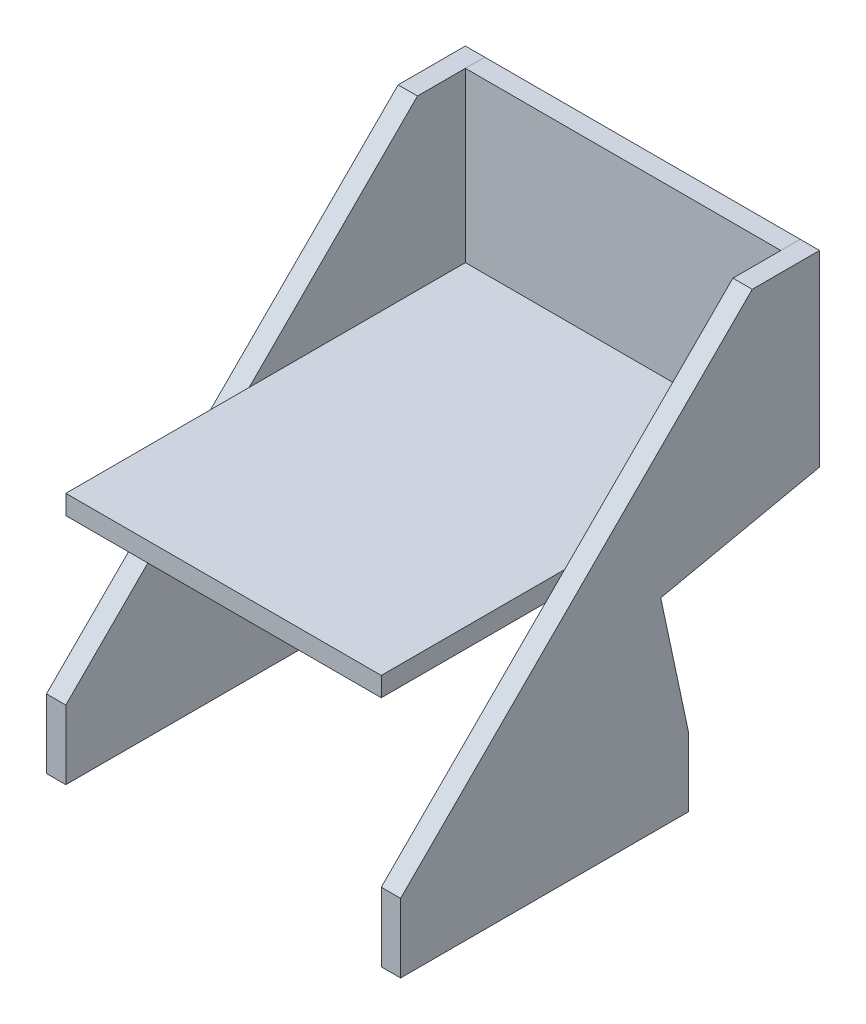
ISO-10303-21;
HEADER;
FILE_DESCRIPTION(('STEP AP214'),'2;1');
FILE_NAME('part.step','',(''),(''),'','','');
FILE_SCHEMA(('AUTOMOTIVE_DESIGN { 1 0 10303 214 1 1 1 1 }'));
ENDSEC;
DATA;
#1=APPLICATION_CONTEXT('core data for automotive mechanical design processes');
#2=APPLICATION_PROTOCOL_DEFINITION('international standard','automotive_design',2000,#1);
#3=PRODUCT_CONTEXT('',#1,'mechanical');
#4=PRODUCT('Part','Part','',(#3));
#5=PRODUCT_RELATED_PRODUCT_CATEGORY('part','',(#4));
#6=PRODUCT_DEFINITION_FORMATION('','',#4);
#7=PRODUCT_DEFINITION_CONTEXT('part definition',#1,'design');
#8=PRODUCT_DEFINITION('design','',#6,#7);
#9=PRODUCT_DEFINITION_SHAPE('','',#8);
#10=(LENGTH_UNIT() NAMED_UNIT(*) SI_UNIT(.MILLI.,.METRE.));
#11=(NAMED_UNIT(*) PLANE_ANGLE_UNIT() SI_UNIT($,.RADIAN.));
#12=(NAMED_UNIT(*) SI_UNIT($,.STERADIAN.) SOLID_ANGLE_UNIT());
#13=UNCERTAINTY_MEASURE_WITH_UNIT(LENGTH_MEASURE(1.E-05),#10,'distance_accuracy_value','');
#14=(GEOMETRIC_REPRESENTATION_CONTEXT(3) GLOBAL_UNCERTAINTY_ASSIGNED_CONTEXT((#13)) GLOBAL_UNIT_ASSIGNED_CONTEXT((#10,
#11,#12)) REPRESENTATION_CONTEXT('',''));
#15=CARTESIAN_POINT('',(0.,0.,0.));
#16=DIRECTION('',(0.,0.,1.));
#17=DIRECTION('',(1.,0.,0.));
#18=AXIS2_PLACEMENT_3D('',#15,#16,#17);
#19=CARTESIAN_POINT('',(21.05,20.,23.75));
#20=DIRECTION('',(0.,0.,-1.));
#21=DIRECTION('',(-1.,0.,0.));
#22=AXIS2_PLACEMENT_3D('',#19,#20,#21);
#23=PLANE('',#22);
#24=DIRECTION('',(0.,-1.,0.));
#25=VECTOR('',#24,1.);
#26=CARTESIAN_POINT('',(21.05,20.,23.75));
#27=LINE('',#26,#25);
#28=CARTESIAN_POINT('',(21.05,-21.7999999999995,23.75));
#29=VERTEX_POINT('',#28);
#30=CARTESIAN_POINT('',(21.05,-30.,23.75));
#31=VERTEX_POINT('',#30);
#32=EDGE_CURVE('E137',#29,#31,#27,.T.);
#33=ORIENTED_EDGE('',*,*,#32,.F.);
#34=DIRECTION('',(-1.,0.,0.));
#35=VECTOR('',#34,1.);
#36=CARTESIAN_POINT('',(21.05,-21.7999999999995,23.75));
#37=LINE('',#36,#35);
#38=CARTESIAN_POINT('',(18.75,-21.7999999999995,23.75));
#39=VERTEX_POINT('',#38);
#40=EDGE_CURVE('E151',#29,#39,#37,.T.);
#41=ORIENTED_EDGE('',*,*,#40,.T.);
#42=DIRECTION('',(0.,-1.,0.));
#43=VECTOR('',#42,1.);
#44=CARTESIAN_POINT('',(18.75,20.,23.75));
#45=LINE('',#44,#43);
#46=CARTESIAN_POINT('',(18.75,-30.,23.75));
#47=VERTEX_POINT('',#46);
#48=EDGE_CURVE('E149',#39,#47,#45,.T.);
#49=ORIENTED_EDGE('',*,*,#48,.T.);
#50=DIRECTION('',(-1.,0.,0.));
#51=VECTOR('',#50,1.);
#52=CARTESIAN_POINT('',(21.05,-30.,23.75));
#53=LINE('',#52,#51);
#54=EDGE_CURVE('E159',#31,#47,#53,.T.);
#55=ORIENTED_EDGE('',*,*,#54,.F.);
#56=EDGE_LOOP('',(#33,#41,#49,#55));
#57=FACE_BOUND('',#56,.T.);
#58=ADVANCED_FACE('F50',(#57),#23,.F.);
#59=CARTESIAN_POINT('',(21.05,-30.,23.75));
#60=DIRECTION('',(0.,1.,0.));
#61=DIRECTION('',(0.,0.,1.));
#62=AXIS2_PLACEMENT_3D('',#59,#60,#61);
#63=PLANE('',#62);
#64=DIRECTION('',(0.,0.,-1.));
#65=VECTOR('',#64,1.);
#66=CARTESIAN_POINT('',(18.75,-30.,23.75));
#67=LINE('',#66,#65);
#68=CARTESIAN_POINT('',(18.75,-30.,-10.4750981265999));
#69=VERTEX_POINT('',#68);
#70=EDGE_CURVE('E130',#47,#69,#67,.T.);
#71=ORIENTED_EDGE('',*,*,#70,.T.);
#72=DIRECTION('',(-1.,0.,0.));
#73=VECTOR('',#72,1.);
#74=CARTESIAN_POINT('',(21.05,-30.,-10.4750981265999));
#75=LINE('',#74,#73);
#76=CARTESIAN_POINT('',(21.05,-30.,-10.4750981265999));
#77=VERTEX_POINT('',#76);
#78=EDGE_CURVE('E64',#77,#69,#75,.T.);
#79=ORIENTED_EDGE('',*,*,#78,.F.);
#80=DIRECTION('',(0.,0.,-1.));
#81=VECTOR('',#80,1.);
#82=CARTESIAN_POINT('',(21.05,-30.,23.75));
#83=LINE('',#82,#81);
#84=EDGE_CURVE('E127',#31,#77,#83,.T.);
#85=ORIENTED_EDGE('',*,*,#84,.F.);
#86=ORIENTED_EDGE('',*,*,#54,.T.);
#87=EDGE_LOOP('',(#71,#79,#85,#86));
#88=FACE_BOUND('',#87,.T.);
#89=ADVANCED_FACE('F125',(#88),#63,.F.);
#90=CARTESIAN_POINT('',(21.05,20.,-26.05));
#91=DIRECTION('',(0.,0.,1.));
#92=DIRECTION('',(1.,0.,0.));
#93=AXIS2_PLACEMENT_3D('',#90,#91,#92);
#94=PLANE('',#93);
#95=DIRECTION('',(0.,1.,0.));
#96=VECTOR('',#95,1.);
#97=CARTESIAN_POINT('',(21.05,20.,-26.05));
#98=LINE('',#97,#96);
#99=CARTESIAN_POINT('',(21.05,-2.3,-26.05));
#100=VERTEX_POINT('',#99);
#101=CARTESIAN_POINT('',(21.05,20.,-26.05));
#102=VERTEX_POINT('',#101);
#103=EDGE_CURVE('E138',#100,#102,#98,.T.);
#104=ORIENTED_EDGE('',*,*,#103,.F.);
#105=DIRECTION('',(-1.,0.,0.));
#106=VECTOR('',#105,1.);
#107=CARTESIAN_POINT('',(21.05,-2.3,-26.05));
#108=LINE('',#107,#106);
#109=CARTESIAN_POINT('',(18.75,-2.3,-26.05));
#110=VERTEX_POINT('',#109);
#111=EDGE_CURVE('E176',#100,#110,#108,.T.);
#112=ORIENTED_EDGE('',*,*,#111,.T.);
#113=DIRECTION('',(0.,1.,0.));
#114=VECTOR('',#113,1.);
#115=CARTESIAN_POINT('',(18.75,20.,-26.05));
#116=LINE('',#115,#114);
#117=CARTESIAN_POINT('',(18.75,20.,-26.05));
#118=VERTEX_POINT('',#117);
#119=EDGE_CURVE('E153',#110,#118,#116,.T.);
#120=ORIENTED_EDGE('',*,*,#119,.T.);
#121=DIRECTION('',(-1.,0.,0.));
#122=VECTOR('',#121,1.);
#123=CARTESIAN_POINT('',(21.05,20.,-26.05));
#124=LINE('',#123,#122);
#125=EDGE_CURVE('E148',#102,#118,#124,.T.);
#126=ORIENTED_EDGE('',*,*,#125,.F.);
#127=EDGE_LOOP('',(#104,#112,#120,#126));
#128=FACE_BOUND('',#127,.T.);
#129=ADVANCED_FACE('F194',(#128),#94,.F.);
#130=CARTESIAN_POINT('',(21.05,20.,23.75));
#131=DIRECTION('',(0.,-1.,0.));
#132=DIRECTION('',(0.,0.,-1.));
#133=AXIS2_PLACEMENT_3D('',#130,#131,#132);
#134=PLANE('',#133);
#135=DIRECTION('',(0.,0.,1.));
#136=VECTOR('',#135,1.);
#137=CARTESIAN_POINT('',(18.75,20.,23.75));
#138=LINE('',#137,#136);
#139=CARTESIAN_POINT('',(18.75,20.,-18.05));
#140=VERTEX_POINT('',#139);
#141=EDGE_CURVE('E142',#118,#140,#138,.T.);
#142=ORIENTED_EDGE('',*,*,#141,.T.);
#143=DIRECTION('',(-1.,0.,0.));
#144=VECTOR('',#143,1.);
#145=CARTESIAN_POINT('',(21.05,20.,-18.05));
#146=LINE('',#145,#144);
#147=CARTESIAN_POINT('',(21.05,20.,-18.05));
#148=VERTEX_POINT('',#147);
#149=EDGE_CURVE('E72',#148,#140,#146,.T.);
#150=ORIENTED_EDGE('',*,*,#149,.F.);
#151=DIRECTION('',(0.,0.,1.));
#152=VECTOR('',#151,1.);
#153=CARTESIAN_POINT('',(21.05,20.,23.75));
#154=LINE('',#153,#152);
#155=EDGE_CURVE('E140',#102,#148,#154,.T.);
#156=ORIENTED_EDGE('',*,*,#155,.F.);
#157=ORIENTED_EDGE('',*,*,#125,.T.);
#158=EDGE_LOOP('',(#142,#150,#156,#157));
#159=FACE_BOUND('',#158,.T.);
#160=ADVANCED_FACE('F189',(#159),#134,.F.);
#161=CARTESIAN_POINT('',(21.05,0.,0.));
#162=DIRECTION('',(1.,0.,0.));
#163=DIRECTION('',(0.,0.,-1.));
#164=AXIS2_PLACEMENT_3D('',#161,#162,#163);
#165=PLANE('',#164);
#166=DIRECTION('',(0.,0.208647904824842,-0.977990823991822));
#167=VECTOR('',#166,1.);
#168=CARTESIAN_POINT('',(21.05,-2.3,-26.05));
#169=LINE('',#168,#167);
#170=CARTESIAN_POINT('',(21.05,-6.32706006023282,-7.17404823869224));
#171=VERTEX_POINT('',#170);
#172=EDGE_CURVE('E131',#171,#100,#169,.T.);
#173=ORIENTED_EDGE('',*,*,#172,.T.);
#174=ORIENTED_EDGE('',*,*,#103,.T.);
#175=ORIENTED_EDGE('',*,*,#155,.T.);
#176=DIRECTION('',(0.,-0.707106781186544,0.707106781186552));
#177=VECTOR('',#176,1.);
#178=CARTESIAN_POINT('',(21.05,20.,-18.05));
#179=LINE('',#178,#177);
#180=EDGE_CURVE('E178',#148,#29,#179,.T.);
#181=ORIENTED_EDGE('',*,*,#180,.T.);
#182=ORIENTED_EDGE('',*,*,#32,.T.);
#183=ORIENTED_EDGE('',*,*,#84,.T.);
#184=DIRECTION('',(0.,1.,0.));
#185=VECTOR('',#184,1.);
#186=CARTESIAN_POINT('',(21.05,-21.7999999999995,-10.4750981265999));
#187=LINE('',#186,#185);
#188=CARTESIAN_POINT('',(21.05,-21.7999999999995,-10.4750981265999));
#189=VERTEX_POINT('',#188);
#190=EDGE_CURVE('E112',#77,#189,#187,.T.);
#191=ORIENTED_EDGE('',*,*,#190,.T.);
#192=DIRECTION('',(0.,0.977990823991822,0.208647904824842));
#193=VECTOR('',#192,1.);
#194=CARTESIAN_POINT('',(21.05,-6.32706006023282,-7.17404823869224));
#195=LINE('',#194,#193);
#196=EDGE_CURVE('E120',#189,#171,#195,.T.);
#197=ORIENTED_EDGE('',*,*,#196,.T.);
#198=EDGE_LOOP('',(#173,#174,#175,#181,#182,#183,#191,#197));
#199=FACE_BOUND('',#198,.T.);
#200=ADVANCED_FACE('F134',(#199),#165,.T.);
#201=CARTESIAN_POINT('',(18.75,0.,0.));
#202=DIRECTION('',(1.,0.,0.));
#203=DIRECTION('',(0.,0.,-1.));
#204=AXIS2_PLACEMENT_3D('',#201,#202,#203);
#205=PLANE('',#204);
#206=ORIENTED_EDGE('',*,*,#119,.F.);
#207=DIRECTION('',(0.,-0.208647904824842,0.977990823991822));
#208=VECTOR('',#207,1.);
#209=CARTESIAN_POINT('',(18.75,-7.51552385144544,-1.60338754392887));
#210=LINE('',#209,#208);
#211=CARTESIAN_POINT('',(18.75,-6.32706006023282,-7.17404823869224));
#212=VERTEX_POINT('',#211);
#213=EDGE_CURVE('E12',#110,#212,#210,.T.);
#214=ORIENTED_EDGE('',*,*,#213,.T.);
#215=DIRECTION('',(0.,-0.977990823991822,-0.208647904824842));
#216=VECTOR('',#215,1.);
#217=CARTESIAN_POINT('',(18.75,1.18846379121262,-5.57066069476337));
#218=LINE('',#217,#216);
#219=CARTESIAN_POINT('',(18.75,-21.7999999999995,-10.4750981265999));
#220=VERTEX_POINT('',#219);
#221=EDGE_CURVE('E57',#212,#220,#218,.T.);
#222=ORIENTED_EDGE('',*,*,#221,.T.);
#223=DIRECTION('',(0.,-1.,0.));
#224=VECTOR('',#223,1.);
#225=CARTESIAN_POINT('',(18.75,0.,-10.4750981265999));
#226=LINE('',#225,#224);
#227=EDGE_CURVE('E163',#220,#69,#226,.T.);
#228=ORIENTED_EDGE('',*,*,#227,.T.);
#229=ORIENTED_EDGE('',*,*,#70,.F.);
#230=ORIENTED_EDGE('',*,*,#48,.F.);
#231=DIRECTION('',(0.,0.707106781186544,-0.707106781186552));
#232=VECTOR('',#231,1.);
#233=CARTESIAN_POINT('',(18.75,0.975000000000116,0.975000000000104));
#234=LINE('',#233,#232);
#235=EDGE_CURVE('E161',#39,#140,#234,.T.);
#236=ORIENTED_EDGE('',*,*,#235,.T.);
#237=ORIENTED_EDGE('',*,*,#141,.F.);
#238=EDGE_LOOP('',(#206,#214,#222,#228,#229,#230,#236,#237));
#239=FACE_BOUND('',#238,.T.);
#240=ADVANCED_FACE('F167',(#239),#205,.F.);
#241=CARTESIAN_POINT('',(21.05,20.,-18.05));
#242=DIRECTION('',(0.,-0.707106781186552,-0.707106781186544));
#243=DIRECTION('',(0.,0.707106781186544,-0.707106781186552));
#244=AXIS2_PLACEMENT_3D('',#241,#242,#243);
#245=PLANE('',#244);
#246=ORIENTED_EDGE('',*,*,#40,.F.);
#247=ORIENTED_EDGE('',*,*,#180,.F.);
#248=ORIENTED_EDGE('',*,*,#149,.T.);
#249=ORIENTED_EDGE('',*,*,#235,.F.);
#250=EDGE_LOOP('',(#246,#247,#248,#249));
#251=FACE_BOUND('',#250,.T.);
#252=ADVANCED_FACE('F196',(#251),#245,.F.);
#253=CARTESIAN_POINT('',(21.05,-2.3,-26.05));
#254=DIRECTION('',(0.,0.977990823991822,0.208647904824842));
#255=DIRECTION('',(0.,-0.208647904824842,0.977990823991822));
#256=AXIS2_PLACEMENT_3D('',#253,#254,#255);
#257=PLANE('',#256);
#258=ORIENTED_EDGE('',*,*,#111,.F.);
#259=ORIENTED_EDGE('',*,*,#172,.F.);
#260=DIRECTION('',(-1.,0.,0.));
#261=VECTOR('',#260,1.);
#262=CARTESIAN_POINT('',(21.05,-6.32706006023282,-7.17404823869224));
#263=LINE('',#262,#261);
#264=EDGE_CURVE('E171',#171,#212,#263,.T.);
#265=ORIENTED_EDGE('',*,*,#264,.T.);
#266=ORIENTED_EDGE('',*,*,#213,.F.);
#267=EDGE_LOOP('',(#258,#259,#265,#266));
#268=FACE_BOUND('',#267,.T.);
#269=ADVANCED_FACE('F174',(#268),#257,.F.);
#270=CARTESIAN_POINT('',(21.05,-6.32706006023282,-7.17404823869224));
#271=DIRECTION('',(0.,-0.208647904824842,0.977990823991822));
#272=DIRECTION('',(0.,-0.977990823991822,-0.208647904824842));
#273=AXIS2_PLACEMENT_3D('',#270,#271,#272);
#274=PLANE('',#273);
#275=ORIENTED_EDGE('',*,*,#264,.F.);
#276=ORIENTED_EDGE('',*,*,#196,.F.);
#277=DIRECTION('',(-1.,0.,0.));
#278=VECTOR('',#277,1.);
#279=CARTESIAN_POINT('',(21.05,-21.7999999999995,-10.4750981265999));
#280=LINE('',#279,#278);
#281=EDGE_CURVE('E115',#189,#220,#280,.T.);
#282=ORIENTED_EDGE('',*,*,#281,.T.);
#283=ORIENTED_EDGE('',*,*,#221,.F.);
#284=EDGE_LOOP('',(#275,#276,#282,#283));
#285=FACE_BOUND('',#284,.T.);
#286=ADVANCED_FACE('F170',(#285),#274,.F.);
#287=CARTESIAN_POINT('',(21.05,-21.7999999999995,-10.4750981265999));
#288=DIRECTION('',(0.,0.,1.));
#289=DIRECTION('',(1.,0.,0.));
#290=AXIS2_PLACEMENT_3D('',#287,#288,#289);
#291=PLANE('',#290);
#292=ORIENTED_EDGE('',*,*,#281,.F.);
#293=ORIENTED_EDGE('',*,*,#190,.F.);
#294=ORIENTED_EDGE('',*,*,#78,.T.);
#295=ORIENTED_EDGE('',*,*,#227,.F.);
#296=EDGE_LOOP('',(#292,#293,#294,#295));
#297=FACE_BOUND('',#296,.T.);
#298=ADVANCED_FACE('F113',(#297),#291,.F.);
#299=CLOSED_SHELL('',(#58,#89,#129,#160,#200,#240,#252,#269,#286,#298));
#300=MANIFOLD_SOLID_BREP('B2',#299);
#301=CARTESIAN_POINT('',(-18.75,20.,-26.05));
#302=DIRECTION('',(1.,0.,0.));
#303=DIRECTION('',(0.,0.,-1.));
#304=AXIS2_PLACEMENT_3D('',#301,#302,#303);
#305=PLANE('',#304);
#306=DIRECTION('',(0.,1.,0.));
#307=VECTOR('',#306,1.);
#308=CARTESIAN_POINT('',(-18.75,20.,-23.75));
#309=LINE('',#308,#307);
#310=CARTESIAN_POINT('',(-18.75,-2.3,-23.75));
#311=VERTEX_POINT('',#310);
#312=CARTESIAN_POINT('',(-18.75,20.,-23.75));
#313=VERTEX_POINT('',#312);
#314=EDGE_CURVE('E363',#311,#313,#309,.T.);
#315=ORIENTED_EDGE('',*,*,#314,.T.);
#316=DIRECTION('',(0.,0.,1.));
#317=VECTOR('',#316,1.);
#318=CARTESIAN_POINT('',(-18.75,20.,-26.05));
#319=LINE('',#318,#317);
#320=CARTESIAN_POINT('',(-18.75,20.,-26.05));
#321=VERTEX_POINT('',#320);
#322=EDGE_CURVE('E48',#321,#313,#319,.T.);
#323=ORIENTED_EDGE('',*,*,#322,.F.);
#324=DIRECTION('',(0.,1.,0.));
#325=VECTOR('',#324,1.);
#326=CARTESIAN_POINT('',(-18.75,20.,-26.05));
#327=LINE('',#326,#325);
#328=CARTESIAN_POINT('',(-18.75,-2.3,-26.05));
#329=VERTEX_POINT('',#328);
#330=EDGE_CURVE('E351',#329,#321,#327,.T.);
#331=ORIENTED_EDGE('',*,*,#330,.F.);
#332=DIRECTION('',(0.,0.,1.));
#333=VECTOR('',#332,1.);
#334=CARTESIAN_POINT('',(-18.75,-2.3,-26.05));
#335=LINE('',#334,#333);
#336=EDGE_CURVE('E359',#329,#311,#335,.T.);
#337=ORIENTED_EDGE('',*,*,#336,.T.);
#338=EDGE_LOOP('',(#315,#323,#331,#337));
#339=FACE_BOUND('',#338,.T.);
#340=ADVANCED_FACE('F300',(#339),#305,.F.);
#341=CARTESIAN_POINT('',(-18.75,20.,-26.05));
#342=DIRECTION('',(0.,-1.,0.));
#343=DIRECTION('',(0.,0.,-1.));
#344=AXIS2_PLACEMENT_3D('',#341,#342,#343);
#345=PLANE('',#344);
#346=DIRECTION('',(1.,0.,0.));
#347=VECTOR('',#346,1.);
#348=CARTESIAN_POINT('',(-18.75,20.,-23.75));
#349=LINE('',#348,#347);
#350=CARTESIAN_POINT('',(18.75,20.,-23.75));
#351=VERTEX_POINT('',#350);
#352=EDGE_CURVE('E355',#313,#351,#349,.T.);
#353=ORIENTED_EDGE('',*,*,#352,.T.);
#354=DIRECTION('',(0.,0.,1.));
#355=VECTOR('',#354,1.);
#356=CARTESIAN_POINT('',(18.75,20.,-26.05));
#357=LINE('',#356,#355);
#358=CARTESIAN_POINT('',(18.75,20.,-26.05));
#359=VERTEX_POINT('',#358);
#360=EDGE_CURVE('E308',#359,#351,#357,.T.);
#361=ORIENTED_EDGE('',*,*,#360,.F.);
#362=DIRECTION('',(1.,0.,0.));
#363=VECTOR('',#362,1.);
#364=CARTESIAN_POINT('',(-18.75,20.,-26.05));
#365=LINE('',#364,#363);
#366=EDGE_CURVE('E346',#321,#359,#365,.T.);
#367=ORIENTED_EDGE('',*,*,#366,.F.);
#368=ORIENTED_EDGE('',*,*,#322,.T.);
#369=EDGE_LOOP('',(#353,#361,#367,#368));
#370=FACE_BOUND('',#369,.T.);
#371=ADVANCED_FACE('F354',(#370),#345,.F.);
#372=CARTESIAN_POINT('',(18.75,20.,-26.05));
#373=DIRECTION('',(-1.,0.,0.));
#374=DIRECTION('',(0.,0.,1.));
#375=AXIS2_PLACEMENT_3D('',#372,#373,#374);
#376=PLANE('',#375);
#377=DIRECTION('',(0.,-1.,0.));
#378=VECTOR('',#377,1.);
#379=CARTESIAN_POINT('',(18.75,20.,-23.75));
#380=LINE('',#379,#378);
#381=CARTESIAN_POINT('',(18.75,-2.3,-23.75));
#382=VERTEX_POINT('',#381);
#383=EDGE_CURVE('E333',#351,#382,#380,.T.);
#384=ORIENTED_EDGE('',*,*,#383,.T.);
#385=DIRECTION('',(0.,0.,1.));
#386=VECTOR('',#385,1.);
#387=CARTESIAN_POINT('',(18.75,-2.3,-26.05));
#388=LINE('',#387,#386);
#389=CARTESIAN_POINT('',(18.75,-2.3,-26.05));
#390=VERTEX_POINT('',#389);
#391=EDGE_CURVE('E356',#390,#382,#388,.T.);
#392=ORIENTED_EDGE('',*,*,#391,.F.);
#393=DIRECTION('',(0.,-1.,0.));
#394=VECTOR('',#393,1.);
#395=CARTESIAN_POINT('',(18.75,20.,-26.05));
#396=LINE('',#395,#394);
#397=EDGE_CURVE('E349',#359,#390,#396,.T.);
#398=ORIENTED_EDGE('',*,*,#397,.F.);
#399=ORIENTED_EDGE('',*,*,#360,.T.);
#400=EDGE_LOOP('',(#384,#392,#398,#399));
#401=FACE_BOUND('',#400,.T.);
#402=ADVANCED_FACE('F357',(#401),#376,.F.);
#403=CARTESIAN_POINT('',(-18.75,-2.3,-26.05));
#404=DIRECTION('',(0.,1.,0.));
#405=DIRECTION('',(0.,0.,1.));
#406=AXIS2_PLACEMENT_3D('',#403,#404,#405);
#407=PLANE('',#406);
#408=DIRECTION('',(-1.,0.,0.));
#409=VECTOR('',#408,1.);
#410=CARTESIAN_POINT('',(-18.75,-2.3,-23.75));
#411=LINE('',#410,#409);
#412=EDGE_CURVE('E339',#382,#311,#411,.T.);
#413=ORIENTED_EDGE('',*,*,#412,.T.);
#414=ORIENTED_EDGE('',*,*,#336,.F.);
#415=DIRECTION('',(-1.,0.,0.));
#416=VECTOR('',#415,1.);
#417=CARTESIAN_POINT('',(-18.75,-2.3,-26.05));
#418=LINE('',#417,#416);
#419=EDGE_CURVE('E316',#390,#329,#418,.T.);
#420=ORIENTED_EDGE('',*,*,#419,.F.);
#421=ORIENTED_EDGE('',*,*,#391,.T.);
#422=EDGE_LOOP('',(#413,#414,#420,#421));
#423=FACE_BOUND('',#422,.T.);
#424=ADVANCED_FACE('F370',(#423),#407,.F.);
#425=CARTESIAN_POINT('',(0.,0.,-26.05));
#426=DIRECTION('',(0.,0.,1.));
#427=DIRECTION('',(1.,0.,0.));
#428=AXIS2_PLACEMENT_3D('',#425,#426,#427);
#429=PLANE('',#428);
#430=ORIENTED_EDGE('',*,*,#330,.T.);
#431=ORIENTED_EDGE('',*,*,#366,.T.);
#432=ORIENTED_EDGE('',*,*,#397,.T.);
#433=ORIENTED_EDGE('',*,*,#419,.T.);
#434=EDGE_LOOP('',(#430,#431,#432,#433));
#435=FACE_BOUND('',#434,.T.);
#436=ADVANCED_FACE('F347',(#435),#429,.F.);
#437=CARTESIAN_POINT('',(0.,0.,-23.75));
#438=DIRECTION('',(0.,0.,1.));
#439=DIRECTION('',(1.,0.,0.));
#440=AXIS2_PLACEMENT_3D('',#437,#438,#439);
#441=PLANE('',#440);
#442=ORIENTED_EDGE('',*,*,#314,.F.);
#443=ORIENTED_EDGE('',*,*,#412,.F.);
#444=ORIENTED_EDGE('',*,*,#383,.F.);
#445=ORIENTED_EDGE('',*,*,#352,.F.);
#446=EDGE_LOOP('',(#442,#443,#444,#445));
#447=FACE_BOUND('',#446,.T.);
#448=ADVANCED_FACE('F373',(#447),#441,.T.);
#449=CLOSED_SHELL('',(#340,#371,#402,#424,#436,#448));
#450=MANIFOLD_SOLID_BREP('B6',#449);
#451=CARTESIAN_POINT('',(-21.05,20.,-26.05));
#452=DIRECTION('',(0.,0.,1.));
#453=DIRECTION('',(0.,-1.,0.));
#454=AXIS2_PLACEMENT_3D('',#451,#452,#453);
#455=PLANE('',#454);
#456=DIRECTION('',(0.,-1.,0.));
#457=VECTOR('',#456,1.);
#458=CARTESIAN_POINT('',(-18.75,20.,-26.05));
#459=LINE('',#458,#457);
#460=CARTESIAN_POINT('',(-18.75,20.,-26.05));
#461=VERTEX_POINT('',#460);
#462=CARTESIAN_POINT('',(-18.75,-2.3,-26.05));
#463=VERTEX_POINT('',#462);
#464=EDGE_CURVE('E532',#461,#463,#459,.T.);
#465=ORIENTED_EDGE('',*,*,#464,.T.);
#466=DIRECTION('',(-1.,0.,0.));
#467=VECTOR('',#466,1.);
#468=CARTESIAN_POINT('',(21.05,-2.3,-26.05));
#469=LINE('',#468,#467);
#470=CARTESIAN_POINT('',(-21.05,-2.3,-26.05));
#471=VERTEX_POINT('',#470);
#472=EDGE_CURVE('E556',#463,#471,#469,.T.);
#473=ORIENTED_EDGE('',*,*,#472,.T.);
#474=DIRECTION('',(0.,-1.,0.));
#475=VECTOR('',#474,1.);
#476=CARTESIAN_POINT('',(-21.05,20.,-26.05));
#477=LINE('',#476,#475);
#478=CARTESIAN_POINT('',(-21.05,20.,-26.05));
#479=VERTEX_POINT('',#478);
#480=EDGE_CURVE('E521',#479,#471,#477,.T.);
#481=ORIENTED_EDGE('',*,*,#480,.F.);
#482=DIRECTION('',(1.,0.,0.));
#483=VECTOR('',#482,1.);
#484=CARTESIAN_POINT('',(-21.05,20.,-26.05));
#485=LINE('',#484,#483);
#486=EDGE_CURVE('E531',#479,#461,#485,.T.);
#487=ORIENTED_EDGE('',*,*,#486,.T.);
#488=EDGE_LOOP('',(#465,#473,#481,#487));
#489=FACE_BOUND('',#488,.T.);
#490=ADVANCED_FACE('F433',(#489),#455,.F.);
#491=CARTESIAN_POINT('',(-21.05,-30.,-26.05));
#492=DIRECTION('',(0.,1.,0.));
#493=DIRECTION('',(0.,0.,1.));
#494=AXIS2_PLACEMENT_3D('',#491,#492,#493);
#495=PLANE('',#494);
#496=DIRECTION('',(0.,0.,1.));
#497=VECTOR('',#496,1.);
#498=CARTESIAN_POINT('',(-21.05,-30.,-26.05));
#499=LINE('',#498,#497);
#500=CARTESIAN_POINT('',(-21.05,-30.,-10.4750981265999));
#501=VERTEX_POINT('',#500);
#502=CARTESIAN_POINT('',(-21.05,-30.,23.75));
#503=VERTEX_POINT('',#502);
#504=EDGE_CURVE('E511',#501,#503,#499,.T.);
#505=ORIENTED_EDGE('',*,*,#504,.F.);
#506=DIRECTION('',(-1.,0.,0.));
#507=VECTOR('',#506,1.);
#508=CARTESIAN_POINT('',(21.05,-30.,-10.4750981265999));
#509=LINE('',#508,#507);
#510=CARTESIAN_POINT('',(-18.75,-30.,-10.4750981265999));
#511=VERTEX_POINT('',#510);
#512=EDGE_CURVE('E495',#511,#501,#509,.T.);
#513=ORIENTED_EDGE('',*,*,#512,.F.);
#514=DIRECTION('',(0.,0.,1.));
#515=VECTOR('',#514,1.);
#516=CARTESIAN_POINT('',(-18.75,-30.,-26.05));
#517=LINE('',#516,#515);
#518=CARTESIAN_POINT('',(-18.75,-30.,23.75));
#519=VERTEX_POINT('',#518);
#520=EDGE_CURVE('E535',#511,#519,#517,.T.);
#521=ORIENTED_EDGE('',*,*,#520,.T.);
#522=DIRECTION('',(1.,0.,0.));
#523=VECTOR('',#522,1.);
#524=CARTESIAN_POINT('',(-21.05,-30.,23.75));
#525=LINE('',#524,#523);
#526=EDGE_CURVE('E518',#503,#519,#525,.T.);
#527=ORIENTED_EDGE('',*,*,#526,.F.);
#528=EDGE_LOOP('',(#505,#513,#521,#527));
#529=FACE_BOUND('',#528,.T.);
#530=ADVANCED_FACE('F516',(#529),#495,.F.);
#531=CARTESIAN_POINT('',(-21.05,20.,23.75));
#532=DIRECTION('',(0.,0.,-1.));
#533=DIRECTION('',(0.,1.,0.));
#534=AXIS2_PLACEMENT_3D('',#531,#532,#533);
#535=PLANE('',#534);
#536=DIRECTION('',(0.,1.,0.));
#537=VECTOR('',#536,1.);
#538=CARTESIAN_POINT('',(-18.75,20.,23.75));
#539=LINE('',#538,#537);
#540=CARTESIAN_POINT('',(-18.75,-21.7999999999995,23.75));
#541=VERTEX_POINT('',#540);
#542=EDGE_CURVE('E538',#519,#541,#539,.T.);
#543=ORIENTED_EDGE('',*,*,#542,.T.);
#544=DIRECTION('',(-1.,0.,0.));
#545=VECTOR('',#544,1.);
#546=CARTESIAN_POINT('',(21.05,-21.7999999999995,23.75));
#547=LINE('',#546,#545);
#548=CARTESIAN_POINT('',(-21.05,-21.7999999999995,23.75));
#549=VERTEX_POINT('',#548);
#550=EDGE_CURVE('E455',#541,#549,#547,.T.);
#551=ORIENTED_EDGE('',*,*,#550,.T.);
#552=DIRECTION('',(0.,1.,0.));
#553=VECTOR('',#552,1.);
#554=CARTESIAN_POINT('',(-21.05,20.,23.75));
#555=LINE('',#554,#553);
#556=EDGE_CURVE('E520',#503,#549,#555,.T.);
#557=ORIENTED_EDGE('',*,*,#556,.F.);
#558=ORIENTED_EDGE('',*,*,#526,.T.);
#559=EDGE_LOOP('',(#543,#551,#557,#558));
#560=FACE_BOUND('',#559,.T.);
#561=ADVANCED_FACE('F570',(#560),#535,.F.);
#562=CARTESIAN_POINT('',(-21.05,20.,-26.05));
#563=DIRECTION('',(0.,-1.,0.));
#564=DIRECTION('',(0.,0.,-1.));
#565=AXIS2_PLACEMENT_3D('',#562,#563,#564);
#566=PLANE('',#565);
#567=DIRECTION('',(0.,0.,-1.));
#568=VECTOR('',#567,1.);
#569=CARTESIAN_POINT('',(-21.05,20.,-26.05));
#570=LINE('',#569,#568);
#571=CARTESIAN_POINT('',(-21.05,20.,-18.05));
#572=VERTEX_POINT('',#571);
#573=EDGE_CURVE('E523',#572,#479,#570,.T.);
#574=ORIENTED_EDGE('',*,*,#573,.F.);
#575=DIRECTION('',(-1.,0.,0.));
#576=VECTOR('',#575,1.);
#577=CARTESIAN_POINT('',(21.05,20.,-18.05));
#578=LINE('',#577,#576);
#579=CARTESIAN_POINT('',(-18.75,20.,-18.05));
#580=VERTEX_POINT('',#579);
#581=EDGE_CURVE('E559',#580,#572,#578,.T.);
#582=ORIENTED_EDGE('',*,*,#581,.F.);
#583=DIRECTION('',(0.,0.,-1.));
#584=VECTOR('',#583,1.);
#585=CARTESIAN_POINT('',(-18.75,20.,-26.05));
#586=LINE('',#585,#584);
#587=EDGE_CURVE('E526',#580,#461,#586,.T.);
#588=ORIENTED_EDGE('',*,*,#587,.T.);
#589=ORIENTED_EDGE('',*,*,#486,.F.);
#590=EDGE_LOOP('',(#574,#582,#588,#589));
#591=FACE_BOUND('',#590,.T.);
#592=ADVANCED_FACE('F574',(#591),#566,.F.);
#593=CARTESIAN_POINT('',(-21.05,0.,0.));
#594=DIRECTION('',(-1.,0.,0.));
#595=DIRECTION('',(0.,0.,1.));
#596=AXIS2_PLACEMENT_3D('',#593,#594,#595);
#597=PLANE('',#596);
#598=DIRECTION('',(0.,0.208647904824842,-0.977990823991823));
#599=VECTOR('',#598,1.);
#600=CARTESIAN_POINT('',(-21.05,-2.3,-26.05));
#601=LINE('',#600,#599);
#602=CARTESIAN_POINT('',(-21.05,-6.32706006023282,-7.17404823869224));
#603=VERTEX_POINT('',#602);
#604=EDGE_CURVE('E505',#603,#471,#601,.T.);
#605=ORIENTED_EDGE('',*,*,#604,.F.);
#606=DIRECTION('',(0.,0.977990823991822,0.208647904824842));
#607=VECTOR('',#606,1.);
#608=CARTESIAN_POINT('',(-21.05,-6.32706006023282,-7.17404823869224));
#609=LINE('',#608,#607);
#610=CARTESIAN_POINT('',(-21.05,-21.7999999999995,-10.4750981265999));
#611=VERTEX_POINT('',#610);
#612=EDGE_CURVE('E514',#611,#603,#609,.T.);
#613=ORIENTED_EDGE('',*,*,#612,.F.);
#614=DIRECTION('',(0.,1.,0.));
#615=VECTOR('',#614,1.);
#616=CARTESIAN_POINT('',(-21.05,-21.7999999999995,-10.4750981265999));
#617=LINE('',#616,#615);
#618=EDGE_CURVE('E498',#501,#611,#617,.T.);
#619=ORIENTED_EDGE('',*,*,#618,.F.);
#620=ORIENTED_EDGE('',*,*,#504,.T.);
#621=ORIENTED_EDGE('',*,*,#556,.T.);
#622=DIRECTION('',(0.,-0.707106781186544,0.707106781186552));
#623=VECTOR('',#622,1.);
#624=CARTESIAN_POINT('',(-21.05,0.975000000000118,0.975000000000103));
#625=LINE('',#624,#623);
#626=EDGE_CURVE('E536',#572,#549,#625,.T.);
#627=ORIENTED_EDGE('',*,*,#626,.F.);
#628=ORIENTED_EDGE('',*,*,#573,.T.);
#629=ORIENTED_EDGE('',*,*,#480,.T.);
#630=EDGE_LOOP('',(#605,#613,#619,#620,#621,#627,#628,#629));
#631=FACE_BOUND('',#630,.T.);
#632=ADVANCED_FACE('F509',(#631),#597,.T.);
#633=CARTESIAN_POINT('',(-18.75,0.,0.));
#634=DIRECTION('',(-1.,0.,0.));
#635=DIRECTION('',(0.,0.,1.));
#636=AXIS2_PLACEMENT_3D('',#633,#634,#635);
#637=PLANE('',#636);
#638=DIRECTION('',(0.,0.977990823991822,0.208647904824842));
#639=VECTOR('',#638,1.);
#640=CARTESIAN_POINT('',(-18.75,1.18846379121262,-5.57066069476337));
#641=LINE('',#640,#639);
#642=CARTESIAN_POINT('',(-18.75,-21.7999999999995,-10.4750981265999));
#643=VERTEX_POINT('',#642);
#644=CARTESIAN_POINT('',(-18.75,-6.32706006023282,-7.17404823869224));
#645=VERTEX_POINT('',#644);
#646=EDGE_CURVE('E440',#643,#645,#641,.T.);
#647=ORIENTED_EDGE('',*,*,#646,.T.);
#648=DIRECTION('',(0.,0.208647904824842,-0.977990823991823));
#649=VECTOR('',#648,1.);
#650=CARTESIAN_POINT('',(-18.75,-7.51552385144544,-1.60338754392887));
#651=LINE('',#650,#649);
#652=EDGE_CURVE('E298',#645,#463,#651,.T.);
#653=ORIENTED_EDGE('',*,*,#652,.T.);
#654=ORIENTED_EDGE('',*,*,#464,.F.);
#655=ORIENTED_EDGE('',*,*,#587,.F.);
#656=DIRECTION('',(0.,-0.707106781186544,0.707106781186552));
#657=VECTOR('',#656,1.);
#658=CARTESIAN_POINT('',(-18.75,0.975000000000118,0.975000000000103));
#659=LINE('',#658,#657);
#660=EDGE_CURVE('E545',#580,#541,#659,.T.);
#661=ORIENTED_EDGE('',*,*,#660,.T.);
#662=ORIENTED_EDGE('',*,*,#542,.F.);
#663=ORIENTED_EDGE('',*,*,#520,.F.);
#664=DIRECTION('',(0.,1.,0.));
#665=VECTOR('',#664,1.);
#666=CARTESIAN_POINT('',(-18.75,0.,-10.4750981265999));
#667=LINE('',#666,#665);
#668=EDGE_CURVE('E501',#511,#643,#667,.T.);
#669=ORIENTED_EDGE('',*,*,#668,.T.);
#670=EDGE_LOOP('',(#647,#653,#654,#655,#661,#662,#663,#669));
#671=FACE_BOUND('',#670,.T.);
#672=ADVANCED_FACE('F549',(#671),#637,.F.);
#673=CARTESIAN_POINT('',(21.05,20.,-18.05));
#674=DIRECTION('',(0.,-0.707106781186552,-0.707106781186544));
#675=DIRECTION('',(0.,0.707106781186544,-0.707106781186552));
#676=AXIS2_PLACEMENT_3D('',#673,#674,#675);
#677=PLANE('',#676);
#678=ORIENTED_EDGE('',*,*,#626,.T.);
#679=ORIENTED_EDGE('',*,*,#550,.F.);
#680=ORIENTED_EDGE('',*,*,#660,.F.);
#681=ORIENTED_EDGE('',*,*,#581,.T.);
#682=EDGE_LOOP('',(#678,#679,#680,#681));
#683=FACE_BOUND('',#682,.T.);
#684=ADVANCED_FACE('F566',(#683),#677,.F.);
#685=CARTESIAN_POINT('',(21.05,-2.3,-26.05));
#686=DIRECTION('',(0.,0.977990823991823,0.208647904824842));
#687=DIRECTION('',(0.,-0.208647904824842,0.977990823991823));
#688=AXIS2_PLACEMENT_3D('',#685,#686,#687);
#689=PLANE('',#688);
#690=DIRECTION('',(-1.,0.,0.));
#691=VECTOR('',#690,1.);
#692=CARTESIAN_POINT('',(21.05,-6.32706006023282,-7.17404823869224));
#693=LINE('',#692,#691);
#694=EDGE_CURVE('E554',#645,#603,#693,.T.);
#695=ORIENTED_EDGE('',*,*,#694,.T.);
#696=ORIENTED_EDGE('',*,*,#604,.T.);
#697=ORIENTED_EDGE('',*,*,#472,.F.);
#698=ORIENTED_EDGE('',*,*,#652,.F.);
#699=EDGE_LOOP('',(#695,#696,#697,#698));
#700=FACE_BOUND('',#699,.T.);
#701=ADVANCED_FACE('F578',(#700),#689,.F.);
#702=CARTESIAN_POINT('',(21.05,-6.32706006023282,-7.17404823869224));
#703=DIRECTION('',(0.,-0.208647904824842,0.977990823991822));
#704=DIRECTION('',(0.,-0.977990823991822,-0.208647904824842));
#705=AXIS2_PLACEMENT_3D('',#702,#703,#704);
#706=PLANE('',#705);
#707=DIRECTION('',(-1.,0.,0.));
#708=VECTOR('',#707,1.);
#709=CARTESIAN_POINT('',(21.05,-21.7999999999995,-10.4750981265999));
#710=LINE('',#709,#708);
#711=EDGE_CURVE('E447',#643,#611,#710,.T.);
#712=ORIENTED_EDGE('',*,*,#711,.T.);
#713=ORIENTED_EDGE('',*,*,#612,.T.);
#714=ORIENTED_EDGE('',*,*,#694,.F.);
#715=ORIENTED_EDGE('',*,*,#646,.F.);
#716=EDGE_LOOP('',(#712,#713,#714,#715));
#717=FACE_BOUND('',#716,.T.);
#718=ADVANCED_FACE('F553',(#717),#706,.F.);
#719=CARTESIAN_POINT('',(21.05,-21.7999999999995,-10.4750981265999));
#720=DIRECTION('',(0.,0.,1.));
#721=DIRECTION('',(1.,0.,0.));
#722=AXIS2_PLACEMENT_3D('',#719,#720,#721);
#723=PLANE('',#722);
#724=ORIENTED_EDGE('',*,*,#512,.T.);
#725=ORIENTED_EDGE('',*,*,#618,.T.);
#726=ORIENTED_EDGE('',*,*,#711,.F.);
#727=ORIENTED_EDGE('',*,*,#668,.F.);
#728=EDGE_LOOP('',(#724,#725,#726,#727));
#729=FACE_BOUND('',#728,.T.);
#730=ADVANCED_FACE('F497',(#729),#723,.F.);
#731=CLOSED_SHELL('',(#490,#530,#561,#592,#632,#672,#684,#701,#718,#730));
#732=MANIFOLD_SOLID_BREP('B42',#731);
#733=CARTESIAN_POINT('',(-18.75,-2.3,23.75));
#734=DIRECTION('',(-1.,0.,0.));
#735=DIRECTION('',(0.,0.,1.));
#736=AXIS2_PLACEMENT_3D('',#733,#734,#735);
#737=PLANE('',#736);
#738=DIRECTION('',(0.,0.,1.));
#739=VECTOR('',#738,1.);
#740=CARTESIAN_POINT('',(-18.75,0.,23.75));
#741=LINE('',#740,#739);
#742=CARTESIAN_POINT('',(-18.75,0.,-23.75));
#743=VERTEX_POINT('',#742);
#744=CARTESIAN_POINT('',(-18.75,0.,23.75));
#745=VERTEX_POINT('',#744);
#746=EDGE_CURVE('E737',#743,#745,#741,.T.);
#747=ORIENTED_EDGE('',*,*,#746,.F.);
#748=DIRECTION('',(0.,1.,0.));
#749=VECTOR('',#748,1.);
#750=CARTESIAN_POINT('',(-18.75,-2.3,-23.75));
#751=LINE('',#750,#749);
#752=CARTESIAN_POINT('',(-18.75,-2.3,-23.75));
#753=VERTEX_POINT('',#752);
#754=EDGE_CURVE('E431',#753,#743,#751,.T.);
#755=ORIENTED_EDGE('',*,*,#754,.F.);
#756=DIRECTION('',(0.,0.,1.));
#757=VECTOR('',#756,1.);
#758=CARTESIAN_POINT('',(-18.75,-2.3,23.75));
#759=LINE('',#758,#757);
#760=CARTESIAN_POINT('',(-18.75,-2.3,23.75));
#761=VERTEX_POINT('',#760);
#762=EDGE_CURVE('E731',#753,#761,#759,.T.);
#763=ORIENTED_EDGE('',*,*,#762,.T.);
#764=DIRECTION('',(0.,1.,0.));
#765=VECTOR('',#764,1.);
#766=CARTESIAN_POINT('',(-18.75,-2.3,23.75));
#767=LINE('',#766,#765);
#768=EDGE_CURVE('E676',#761,#745,#767,.T.);
#769=ORIENTED_EDGE('',*,*,#768,.T.);
#770=EDGE_LOOP('',(#747,#755,#763,#769));
#771=FACE_BOUND('',#770,.T.);
#772=ADVANCED_FACE('F673',(#771),#737,.T.);
#773=CARTESIAN_POINT('',(18.75,-2.3,-23.75));
#774=DIRECTION('',(0.,0.,-1.));
#775=DIRECTION('',(-1.,0.,0.));
#776=AXIS2_PLACEMENT_3D('',#773,#774,#775);
#777=PLANE('',#776);
#778=DIRECTION('',(-1.,0.,0.));
#779=VECTOR('',#778,1.);
#780=CARTESIAN_POINT('',(18.75,0.,-23.75));
#781=LINE('',#780,#779);
#782=CARTESIAN_POINT('',(18.75,0.,-23.75));
#783=VERTEX_POINT('',#782);
#784=EDGE_CURVE('E733',#783,#743,#781,.T.);
#785=ORIENTED_EDGE('',*,*,#784,.F.);
#786=DIRECTION('',(0.,1.,0.));
#787=VECTOR('',#786,1.);
#788=CARTESIAN_POINT('',(18.75,-2.3,-23.75));
#789=LINE('',#788,#787);
#790=CARTESIAN_POINT('',(18.75,-2.3,-23.75));
#791=VERTEX_POINT('',#790);
#792=EDGE_CURVE('E682',#791,#783,#789,.T.);
#793=ORIENTED_EDGE('',*,*,#792,.F.);
#794=DIRECTION('',(-1.,0.,0.));
#795=VECTOR('',#794,1.);
#796=CARTESIAN_POINT('',(18.75,-2.3,-23.75));
#797=LINE('',#796,#795);
#798=EDGE_CURVE('E728',#791,#753,#797,.T.);
#799=ORIENTED_EDGE('',*,*,#798,.T.);
#800=ORIENTED_EDGE('',*,*,#754,.T.);
#801=EDGE_LOOP('',(#785,#793,#799,#800));
#802=FACE_BOUND('',#801,.T.);
#803=ADVANCED_FACE('F747',(#802),#777,.T.);
#804=CARTESIAN_POINT('',(18.75,-2.3,23.75));
#805=DIRECTION('',(1.,0.,0.));
#806=DIRECTION('',(0.,0.,-1.));
#807=AXIS2_PLACEMENT_3D('',#804,#805,#806);
#808=PLANE('',#807);
#809=DIRECTION('',(0.,0.,-1.));
#810=VECTOR('',#809,1.);
#811=CARTESIAN_POINT('',(18.75,0.,23.75));
#812=LINE('',#811,#810);
#813=CARTESIAN_POINT('',(18.75,0.,23.75));
#814=VERTEX_POINT('',#813);
#815=EDGE_CURVE('E723',#814,#783,#812,.T.);
#816=ORIENTED_EDGE('',*,*,#815,.F.);
#817=DIRECTION('',(0.,1.,0.));
#818=VECTOR('',#817,1.);
#819=CARTESIAN_POINT('',(18.75,-2.3,23.75));
#820=LINE('',#819,#818);
#821=CARTESIAN_POINT('',(18.75,-2.3,23.75));
#822=VERTEX_POINT('',#821);
#823=EDGE_CURVE('E718',#822,#814,#820,.T.);
#824=ORIENTED_EDGE('',*,*,#823,.F.);
#825=DIRECTION('',(0.,0.,-1.));
#826=VECTOR('',#825,1.);
#827=CARTESIAN_POINT('',(18.75,-2.3,23.75));
#828=LINE('',#827,#826);
#829=EDGE_CURVE('E721',#822,#791,#828,.T.);
#830=ORIENTED_EDGE('',*,*,#829,.T.);
#831=ORIENTED_EDGE('',*,*,#792,.T.);
#832=EDGE_LOOP('',(#816,#824,#830,#831));
#833=FACE_BOUND('',#832,.T.);
#834=ADVANCED_FACE('F720',(#833),#808,.T.);
#835=CARTESIAN_POINT('',(18.75,-2.3,23.75));
#836=DIRECTION('',(0.,0.,1.));
#837=DIRECTION('',(1.,0.,0.));
#838=AXIS2_PLACEMENT_3D('',#835,#836,#837);
#839=PLANE('',#838);
#840=DIRECTION('',(1.,0.,0.));
#841=VECTOR('',#840,1.);
#842=CARTESIAN_POINT('',(18.75,0.,23.75));
#843=LINE('',#842,#841);
#844=EDGE_CURVE('E740',#745,#814,#843,.T.);
#845=ORIENTED_EDGE('',*,*,#844,.F.);
#846=ORIENTED_EDGE('',*,*,#768,.F.);
#847=DIRECTION('',(1.,0.,0.));
#848=VECTOR('',#847,1.);
#849=CARTESIAN_POINT('',(18.75,-2.3,23.75));
#850=LINE('',#849,#848);
#851=EDGE_CURVE('E727',#761,#822,#850,.T.);
#852=ORIENTED_EDGE('',*,*,#851,.T.);
#853=ORIENTED_EDGE('',*,*,#823,.T.);
#854=EDGE_LOOP('',(#845,#846,#852,#853));
#855=FACE_BOUND('',#854,.T.);
#856=ADVANCED_FACE('F730',(#855),#839,.T.);
#857=CARTESIAN_POINT('',(0.,-2.3,0.));
#858=DIRECTION('',(0.,1.,0.));
#859=DIRECTION('',(0.,0.,1.));
#860=AXIS2_PLACEMENT_3D('',#857,#858,#859);
#861=PLANE('',#860);
#862=ORIENTED_EDGE('',*,*,#762,.F.);
#863=ORIENTED_EDGE('',*,*,#798,.F.);
#864=ORIENTED_EDGE('',*,*,#829,.F.);
#865=ORIENTED_EDGE('',*,*,#851,.F.);
#866=EDGE_LOOP('',(#862,#863,#864,#865));
#867=FACE_BOUND('',#866,.T.);
#868=ADVANCED_FACE('F726',(#867),#861,.F.);
#869=CARTESIAN_POINT('',(0.,0.,0.));
#870=DIRECTION('',(0.,1.,0.));
#871=DIRECTION('',(0.,0.,1.));
#872=AXIS2_PLACEMENT_3D('',#869,#870,#871);
#873=PLANE('',#872);
#874=ORIENTED_EDGE('',*,*,#746,.T.);
#875=ORIENTED_EDGE('',*,*,#844,.T.);
#876=ORIENTED_EDGE('',*,*,#815,.T.);
#877=ORIENTED_EDGE('',*,*,#784,.T.);
#878=EDGE_LOOP('',(#874,#875,#876,#877));
#879=FACE_BOUND('',#878,.T.);
#880=ADVANCED_FACE('F746',(#879),#873,.T.);
#881=CLOSED_SHELL('',(#772,#803,#834,#856,#868,#880));
#882=MANIFOLD_SOLID_BREP('B292',#881);
#883=ADVANCED_BREP_SHAPE_REPRESENTATION('',(#18,#300,#450,#732,#882),#14);
#884=SHAPE_DEFINITION_REPRESENTATION(#9,#883);
ENDSEC;
END-ISO-10303-21;
